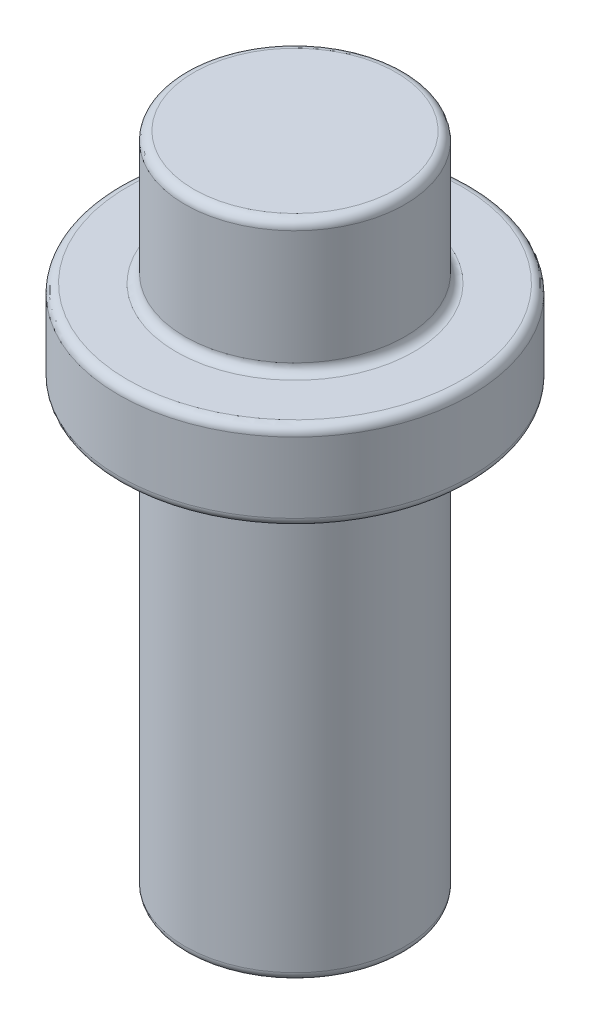
ISO-10303-21;
HEADER;
FILE_DESCRIPTION(('STEP AP214'),'2;1');
FILE_NAME('part.step','',(''),(''),'','','');
FILE_SCHEMA(('AUTOMOTIVE_DESIGN { 1 0 10303 214 1 1 1 1 }'));
ENDSEC;
DATA;
#1=APPLICATION_CONTEXT('core data for automotive mechanical design processes');
#2=APPLICATION_PROTOCOL_DEFINITION('international standard','automotive_design',2000,#1);
#3=PRODUCT_CONTEXT('',#1,'mechanical');
#4=PRODUCT('Part','Part','',(#3));
#5=PRODUCT_RELATED_PRODUCT_CATEGORY('part','',(#4));
#6=PRODUCT_DEFINITION_FORMATION('','',#4);
#7=PRODUCT_DEFINITION_CONTEXT('part definition',#1,'design');
#8=PRODUCT_DEFINITION('design','',#6,#7);
#9=PRODUCT_DEFINITION_SHAPE('','',#8);
#10=(LENGTH_UNIT() NAMED_UNIT(*) SI_UNIT(.MILLI.,.METRE.));
#11=(NAMED_UNIT(*) PLANE_ANGLE_UNIT() SI_UNIT($,.RADIAN.));
#12=(NAMED_UNIT(*) SI_UNIT($,.STERADIAN.) SOLID_ANGLE_UNIT());
#13=UNCERTAINTY_MEASURE_WITH_UNIT(LENGTH_MEASURE(1.E-05),#10,'distance_accuracy_value','');
#14=(GEOMETRIC_REPRESENTATION_CONTEXT(3) GLOBAL_UNCERTAINTY_ASSIGNED_CONTEXT((#13)) GLOBAL_UNIT_ASSIGNED_CONTEXT((#10,
#11,#12)) REPRESENTATION_CONTEXT('',''));
#15=CARTESIAN_POINT('',(0.,0.,0.));
#16=DIRECTION('',(0.,0.,1.));
#17=DIRECTION('',(1.,0.,0.));
#18=AXIS2_PLACEMENT_3D('',#15,#16,#17);
#19=CARTESIAN_POINT('',(0.,15.,0.));
#20=DIRECTION('',(0.,-1.,0.));
#21=DIRECTION('',(0.,0.,-1.));
#22=AXIS2_PLACEMENT_3D('',#19,#20,#21);
#23=CYLINDRICAL_SURFACE('',#22,2.5);
#24=CARTESIAN_POINT('',(0.,12.2,0.));
#25=DIRECTION('',(0.,1.,0.));
#26=DIRECTION('',(0.,0.,1.));
#27=AXIS2_PLACEMENT_3D('',#24,#25,#26);
#28=CIRCLE('',#27,2.5);
#29=CARTESIAN_POINT('',(0.,12.2,2.5));
#30=VERTEX_POINT('',#29);
#31=EDGE_CURVE('E37',#30,#30,#28,.T.);
#32=ORIENTED_EDGE('',*,*,#31,.T.);
#33=EDGE_LOOP('',(#32));
#34=FACE_BOUND('',#33,.T.);
#35=CARTESIAN_POINT('',(0.,14.8,0.));
#36=DIRECTION('',(0.,1.,0.));
#37=DIRECTION('',(0.,0.,1.));
#38=AXIS2_PLACEMENT_3D('',#35,#36,#37);
#39=CIRCLE('',#38,2.5);
#40=CARTESIAN_POINT('',(0.,14.8,2.5));
#41=VERTEX_POINT('',#40);
#42=EDGE_CURVE('E41',#41,#41,#39,.F.);
#43=ORIENTED_EDGE('',*,*,#42,.T.);
#44=EDGE_LOOP('',(#43));
#45=FACE_BOUND('',#44,.T.);
#46=ADVANCED_FACE('F30',(#34,#45),#23,.T.);
#47=CARTESIAN_POINT('',(0.,15.,0.));
#48=DIRECTION('',(0.,1.,0.));
#49=DIRECTION('',(0.,0.,1.));
#50=AXIS2_PLACEMENT_3D('',#47,#48,#49);
#51=PLANE('',#50);
#52=CARTESIAN_POINT('',(0.,15.,0.));
#53=DIRECTION('',(0.,1.,0.));
#54=DIRECTION('',(0.,0.,1.));
#55=AXIS2_PLACEMENT_3D('',#52,#53,#54);
#56=CIRCLE('',#55,2.3);
#57=CARTESIAN_POINT('',(0.,15.,2.3));
#58=VERTEX_POINT('',#57);
#59=EDGE_CURVE('E10',#58,#58,#56,.T.);
#60=ORIENTED_EDGE('',*,*,#59,.T.);
#61=EDGE_LOOP('',(#60));
#62=FACE_BOUND('',#61,.T.);
#63=ADVANCED_FACE('F102',(#62),#51,.T.);
#64=CARTESIAN_POINT('',(0.,12.,0.));
#65=DIRECTION('',(0.,-1.,0.));
#66=DIRECTION('',(0.,0.,-1.));
#67=AXIS2_PLACEMENT_3D('',#64,#65,#66);
#68=CYLINDRICAL_SURFACE('',#67,4.);
#69=CARTESIAN_POINT('',(0.,11.8,0.));
#70=DIRECTION('',(0.,1.,0.));
#71=DIRECTION('',(0.,0.,1.));
#72=AXIS2_PLACEMENT_3D('',#69,#70,#71);
#73=CIRCLE('',#72,4.);
#74=CARTESIAN_POINT('',(0.,11.8,4.));
#75=VERTEX_POINT('',#74);
#76=EDGE_CURVE('E53',#75,#75,#73,.F.);
#77=ORIENTED_EDGE('',*,*,#76,.T.);
#78=EDGE_LOOP('',(#77));
#79=FACE_BOUND('',#78,.T.);
#80=CARTESIAN_POINT('',(0.,10.2,0.));
#81=DIRECTION('',(0.,1.,0.));
#82=DIRECTION('',(0.,0.,1.));
#83=AXIS2_PLACEMENT_3D('',#80,#81,#82);
#84=CIRCLE('',#83,4.);
#85=CARTESIAN_POINT('',(0.,10.2,4.));
#86=VERTEX_POINT('',#85);
#87=EDGE_CURVE('E56',#86,#86,#84,.T.);
#88=ORIENTED_EDGE('',*,*,#87,.T.);
#89=EDGE_LOOP('',(#88));
#90=FACE_BOUND('',#89,.T.);
#91=ADVANCED_FACE('F97',(#79,#90),#68,.T.);
#92=CARTESIAN_POINT('',(0.,12.,0.));
#93=DIRECTION('',(0.,1.,0.));
#94=DIRECTION('',(0.,0.,1.));
#95=AXIS2_PLACEMENT_3D('',#92,#93,#94);
#96=PLANE('',#95);
#97=CARTESIAN_POINT('',(0.,12.,0.));
#98=DIRECTION('',(0.,1.,0.));
#99=DIRECTION('',(0.,0.,1.));
#100=AXIS2_PLACEMENT_3D('',#97,#98,#99);
#101=CIRCLE('',#100,3.8);
#102=CARTESIAN_POINT('',(0.,12.,3.8));
#103=VERTEX_POINT('',#102);
#104=EDGE_CURVE('E59',#103,#103,#101,.T.);
#105=ORIENTED_EDGE('',*,*,#104,.T.);
#106=EDGE_LOOP('',(#105));
#107=FACE_BOUND('',#106,.T.);
#108=CARTESIAN_POINT('',(0.,12.,0.));
#109=DIRECTION('',(0.,1.,0.));
#110=DIRECTION('',(0.,0.,1.));
#111=AXIS2_PLACEMENT_3D('',#108,#109,#110);
#112=CIRCLE('',#111,2.7);
#113=CARTESIAN_POINT('',(0.,12.,2.7));
#114=VERTEX_POINT('',#113);
#115=EDGE_CURVE('E62',#114,#114,#112,.F.);
#116=ORIENTED_EDGE('',*,*,#115,.T.);
#117=EDGE_LOOP('',(#116));
#118=FACE_BOUND('',#117,.T.);
#119=ADVANCED_FACE('F88',(#107,#118),#96,.T.);
#120=CARTESIAN_POINT('',(0.,10.,0.));
#121=DIRECTION('',(0.,1.,0.));
#122=DIRECTION('',(0.,0.,1.));
#123=AXIS2_PLACEMENT_3D('',#120,#121,#122);
#124=PLANE('',#123);
#125=CARTESIAN_POINT('',(0.,10.,0.));
#126=DIRECTION('',(0.,1.,0.));
#127=DIRECTION('',(0.,0.,1.));
#128=AXIS2_PLACEMENT_3D('',#125,#126,#127);
#129=CIRCLE('',#128,3.8);
#130=CARTESIAN_POINT('',(0.,10.,3.8));
#131=VERTEX_POINT('',#130);
#132=EDGE_CURVE('E45',#131,#131,#129,.F.);
#133=ORIENTED_EDGE('',*,*,#132,.T.);
#134=EDGE_LOOP('',(#133));
#135=FACE_BOUND('',#134,.T.);
#136=CARTESIAN_POINT('',(0.,10.,0.));
#137=DIRECTION('',(0.,1.,0.));
#138=DIRECTION('',(0.,0.,1.));
#139=AXIS2_PLACEMENT_3D('',#136,#137,#138);
#140=CIRCLE('',#139,2.7);
#141=CARTESIAN_POINT('',(0.,10.,2.7));
#142=VERTEX_POINT('',#141);
#143=EDGE_CURVE('E50',#142,#142,#140,.T.);
#144=ORIENTED_EDGE('',*,*,#143,.T.);
#145=EDGE_LOOP('',(#144));
#146=FACE_BOUND('',#145,.T.);
#147=ADVANCED_FACE('F85',(#135,#146),#124,.F.);
#148=CARTESIAN_POINT('',(0.,0.,0.));
#149=DIRECTION('',(0.,1.,0.));
#150=DIRECTION('',(0.,0.,1.));
#151=AXIS2_PLACEMENT_3D('',#148,#149,#150);
#152=PLANE('',#151);
#153=CARTESIAN_POINT('',(0.,0.,0.));
#154=DIRECTION('',(0.,1.,0.));
#155=DIRECTION('',(0.,0.,1.));
#156=AXIS2_PLACEMENT_3D('',#153,#154,#155);
#157=CIRCLE('',#156,2.3);
#158=CARTESIAN_POINT('',(0.,0.,2.3));
#159=VERTEX_POINT('',#158);
#160=EDGE_CURVE('E65',#159,#159,#157,.F.);
#161=ORIENTED_EDGE('',*,*,#160,.T.);
#162=EDGE_LOOP('',(#161));
#163=FACE_BOUND('',#162,.T.);
#164=ADVANCED_FACE('F87',(#163),#152,.F.);
#165=CARTESIAN_POINT('',(0.,0.200000000000001,0.));
#166=DIRECTION('',(0.,1.,0.));
#167=DIRECTION('',(0.,0.,1.));
#168=AXIS2_PLACEMENT_3D('',#165,#166,#167);
#169=CIRCLE('',#168,2.5);
#170=CARTESIAN_POINT('',(0.,0.200000000000001,2.5));
#171=VERTEX_POINT('',#170);
#172=EDGE_CURVE('E68',#171,#171,#169,.T.);
#173=ORIENTED_EDGE('',*,*,#172,.T.);
#174=EDGE_LOOP('',(#173));
#175=FACE_BOUND('',#174,.T.);
#176=CARTESIAN_POINT('',(0.,9.8,0.));
#177=DIRECTION('',(0.,1.,0.));
#178=DIRECTION('',(0.,0.,1.));
#179=AXIS2_PLACEMENT_3D('',#176,#177,#178);
#180=CIRCLE('',#179,2.5);
#181=CARTESIAN_POINT('',(0.,9.8,2.5));
#182=VERTEX_POINT('',#181);
#183=EDGE_CURVE('E71',#182,#182,#180,.F.);
#184=ORIENTED_EDGE('',*,*,#183,.T.);
#185=EDGE_LOOP('',(#184));
#186=FACE_BOUND('',#185,.T.);
#187=ADVANCED_FACE('F75',(#175,#186),#23,.T.);
#188=CARTESIAN_POINT('',(0.,0.200000000000001,0.));
#189=DIRECTION('',(0.,1.,0.));
#190=DIRECTION('',(0.,0.,1.));
#191=AXIS2_PLACEMENT_3D('',#188,#189,#190);
#192=TOROIDAL_SURFACE('',#191,2.3,0.2);
#193=ORIENTED_EDGE('',*,*,#160,.F.);
#194=EDGE_LOOP('',(#193));
#195=FACE_BOUND('',#194,.T.);
#196=ORIENTED_EDGE('',*,*,#172,.F.);
#197=EDGE_LOOP('',(#196));
#198=FACE_BOUND('',#197,.T.);
#199=ADVANCED_FACE('F111',(#195,#198),#192,.T.);
#200=CARTESIAN_POINT('',(0.,11.8,0.));
#201=DIRECTION('',(0.,1.,0.));
#202=DIRECTION('',(0.,0.,1.));
#203=AXIS2_PLACEMENT_3D('',#200,#201,#202);
#204=TOROIDAL_SURFACE('',#203,3.8,0.2);
#205=ORIENTED_EDGE('',*,*,#76,.F.);
#206=EDGE_LOOP('',(#205));
#207=FACE_BOUND('',#206,.T.);
#208=ORIENTED_EDGE('',*,*,#104,.F.);
#209=EDGE_LOOP('',(#208));
#210=FACE_BOUND('',#209,.T.);
#211=ADVANCED_FACE('F116',(#207,#210),#204,.T.);
#212=CARTESIAN_POINT('',(0.,10.2,0.));
#213=DIRECTION('',(0.,1.,0.));
#214=DIRECTION('',(0.,0.,1.));
#215=AXIS2_PLACEMENT_3D('',#212,#213,#214);
#216=TOROIDAL_SURFACE('',#215,3.8,0.2);
#217=ORIENTED_EDGE('',*,*,#132,.F.);
#218=EDGE_LOOP('',(#217));
#219=FACE_BOUND('',#218,.T.);
#220=ORIENTED_EDGE('',*,*,#87,.F.);
#221=EDGE_LOOP('',(#220));
#222=FACE_BOUND('',#221,.T.);
#223=ADVANCED_FACE('F81',(#219,#222),#216,.T.);
#224=CARTESIAN_POINT('',(0.,9.8,0.));
#225=DIRECTION('',(0.,1.,0.));
#226=DIRECTION('',(0.,0.,1.));
#227=AXIS2_PLACEMENT_3D('',#224,#225,#226);
#228=TOROIDAL_SURFACE('',#227,2.7,0.2);
#229=ORIENTED_EDGE('',*,*,#183,.F.);
#230=EDGE_LOOP('',(#229));
#231=FACE_BOUND('',#230,.T.);
#232=ORIENTED_EDGE('',*,*,#143,.F.);
#233=EDGE_LOOP('',(#232));
#234=FACE_BOUND('',#233,.T.);
#235=ADVANCED_FACE('F77',(#231,#234),#228,.F.);
#236=CARTESIAN_POINT('',(0.,12.2,0.));
#237=DIRECTION('',(0.,1.,0.));
#238=DIRECTION('',(0.,0.,1.));
#239=AXIS2_PLACEMENT_3D('',#236,#237,#238);
#240=TOROIDAL_SURFACE('',#239,2.7,0.2);
#241=ORIENTED_EDGE('',*,*,#115,.F.);
#242=EDGE_LOOP('',(#241));
#243=FACE_BOUND('',#242,.T.);
#244=ORIENTED_EDGE('',*,*,#31,.F.);
#245=EDGE_LOOP('',(#244));
#246=FACE_BOUND('',#245,.T.);
#247=ADVANCED_FACE('F80',(#243,#246),#240,.F.);
#248=CARTESIAN_POINT('',(0.,14.8,0.));
#249=DIRECTION('',(0.,1.,0.));
#250=DIRECTION('',(0.,0.,1.));
#251=AXIS2_PLACEMENT_3D('',#248,#249,#250);
#252=TOROIDAL_SURFACE('',#251,2.3,0.2);
#253=ORIENTED_EDGE('',*,*,#42,.F.);
#254=EDGE_LOOP('',(#253));
#255=FACE_BOUND('',#254,.T.);
#256=ORIENTED_EDGE('',*,*,#59,.F.);
#257=EDGE_LOOP('',(#256));
#258=FACE_BOUND('',#257,.T.);
#259=ADVANCED_FACE('F32',(#255,#258),#252,.T.);
#260=CLOSED_SHELL('',(#46,#63,#91,#119,#147,#164,#187,#199,#211,#223,#235,#247,#259));
#261=MANIFOLD_SOLID_BREP('B2',#260);
#262=ADVANCED_BREP_SHAPE_REPRESENTATION('',(#18,#261),#14);
#263=SHAPE_DEFINITION_REPRESENTATION(#9,#262);
ENDSEC;
END-ISO-10303-21;
